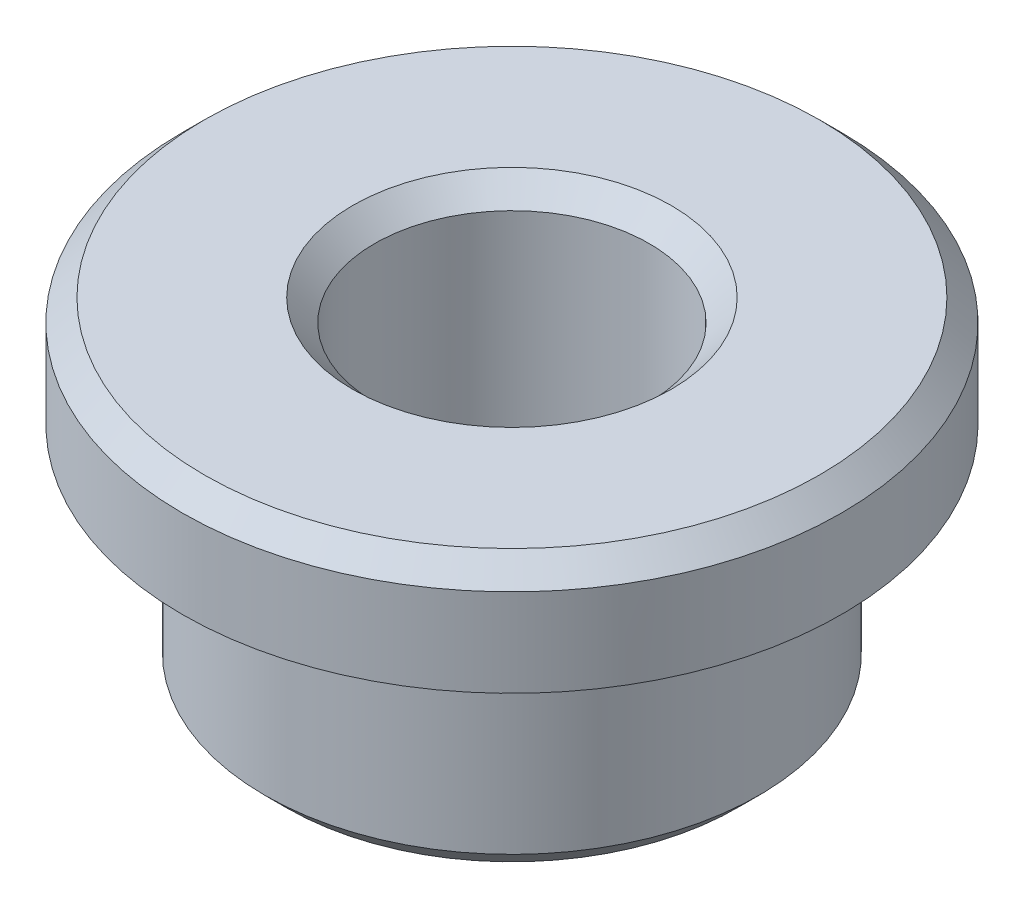
ISO-10303-21;
HEADER;
FILE_DESCRIPTION(('STEP AP214'),'2;1');
FILE_NAME('part.step','',(''),(''),'','','');
FILE_SCHEMA(('AUTOMOTIVE_DESIGN { 1 0 10303 214 1 1 1 1 }'));
ENDSEC;
DATA;
#1=APPLICATION_CONTEXT('core data for automotive mechanical design processes');
#2=APPLICATION_PROTOCOL_DEFINITION('international standard','automotive_design',2000,#1);
#3=PRODUCT_CONTEXT('',#1,'mechanical');
#4=PRODUCT('Part','Part','',(#3));
#5=PRODUCT_RELATED_PRODUCT_CATEGORY('part','',(#4));
#6=PRODUCT_DEFINITION_FORMATION('','',#4);
#7=PRODUCT_DEFINITION_CONTEXT('part definition',#1,'design');
#8=PRODUCT_DEFINITION('design','',#6,#7);
#9=PRODUCT_DEFINITION_SHAPE('','',#8);
#10=(LENGTH_UNIT() NAMED_UNIT(*) SI_UNIT(.MILLI.,.METRE.));
#11=(NAMED_UNIT(*) PLANE_ANGLE_UNIT() SI_UNIT($,.RADIAN.));
#12=(NAMED_UNIT(*) SI_UNIT($,.STERADIAN.) SOLID_ANGLE_UNIT());
#13=UNCERTAINTY_MEASURE_WITH_UNIT(LENGTH_MEASURE(1.E-05),#10,'distance_accuracy_value','');
#14=(GEOMETRIC_REPRESENTATION_CONTEXT(3) GLOBAL_UNCERTAINTY_ASSIGNED_CONTEXT((#13)) GLOBAL_UNIT_ASSIGNED_CONTEXT((#10,
#11,#12)) REPRESENTATION_CONTEXT('',''));
#15=CARTESIAN_POINT('',(0.,0.,0.));
#16=DIRECTION('',(0.,0.,1.));
#17=DIRECTION('',(1.,0.,0.));
#18=AXIS2_PLACEMENT_3D('',#15,#16,#17);
#19=CARTESIAN_POINT('',(0.,0.,-1.25));
#20=DIRECTION('',(0.,1.,0.));
#21=DIRECTION('',(0.,0.,1.));
#22=AXIS2_PLACEMENT_3D('',#19,#20,#21);
#23=PLANE('',#22);
#24=CARTESIAN_POINT('',(0.,0.,0.));
#25=DIRECTION('',(0.,1.,0.));
#26=DIRECTION('',(0.,0.,1.));
#27=AXIS2_PLACEMENT_3D('',#24,#25,#26);
#28=CIRCLE('',#27,2.05);
#29=CARTESIAN_POINT('',(0.,0.,2.05));
#30=VERTEX_POINT('',#29);
#31=EDGE_CURVE('E10',#30,#30,#28,.F.);
#32=ORIENTED_EDGE('',*,*,#31,.T.);
#33=EDGE_LOOP('',(#32));
#34=FACE_BOUND('',#33,.T.);
#35=CARTESIAN_POINT('',(0.,0.,0.));
#36=DIRECTION('',(0.,1.,0.));
#37=DIRECTION('',(0.,0.,1.));
#38=AXIS2_PLACEMENT_3D('',#35,#36,#37);
#39=CIRCLE('',#38,1.25);
#40=CARTESIAN_POINT('',(0.,0.,1.25));
#41=VERTEX_POINT('',#40);
#42=EDGE_CURVE('E65',#41,#41,#39,.T.);
#43=ORIENTED_EDGE('',*,*,#42,.T.);
#44=EDGE_LOOP('',(#43));
#45=FACE_BOUND('',#44,.T.);
#46=ADVANCED_FACE('F33',(#34,#45),#23,.F.);
#47=CARTESIAN_POINT('',(0.,6.79117403832386,0.));
#48=DIRECTION('',(0.,1.,0.));
#49=DIRECTION('',(0.,0.,1.));
#50=AXIS2_PLACEMENT_3D('',#47,#48,#49);
#51=CYLINDRICAL_SURFACE('',#50,2.25);
#52=CARTESIAN_POINT('',(0.,0.199999999999999,0.));
#53=DIRECTION('',(0.,1.,0.));
#54=DIRECTION('',(0.,0.,1.));
#55=AXIS2_PLACEMENT_3D('',#52,#53,#54);
#56=CIRCLE('',#55,2.25);
#57=CARTESIAN_POINT('',(0.,0.199999999999999,2.25));
#58=VERTEX_POINT('',#57);
#59=EDGE_CURVE('E40',#58,#58,#56,.T.);
#60=ORIENTED_EDGE('',*,*,#59,.T.);
#61=EDGE_LOOP('',(#60));
#62=FACE_BOUND('',#61,.T.);
#63=CARTESIAN_POINT('',(0.,2.,0.));
#64=DIRECTION('',(0.,1.,0.));
#65=DIRECTION('',(0.,0.,1.));
#66=AXIS2_PLACEMENT_3D('',#63,#64,#65);
#67=CIRCLE('',#66,2.25);
#68=CARTESIAN_POINT('',(0.,2.,2.25));
#69=VERTEX_POINT('',#68);
#70=EDGE_CURVE('E59',#69,#69,#67,.T.);
#71=ORIENTED_EDGE('',*,*,#70,.F.);
#72=EDGE_LOOP('',(#71));
#73=FACE_BOUND('',#72,.T.);
#74=ADVANCED_FACE('F87',(#62,#73),#51,.T.);
#75=CARTESIAN_POINT('',(0.,2.,-2.25));
#76=DIRECTION('',(0.,1.,0.));
#77=DIRECTION('',(0.,0.,1.));
#78=AXIS2_PLACEMENT_3D('',#75,#76,#77);
#79=PLANE('',#78);
#80=CARTESIAN_POINT('',(0.,2.,0.));
#81=DIRECTION('',(0.,1.,0.));
#82=DIRECTION('',(0.,0.,1.));
#83=AXIS2_PLACEMENT_3D('',#80,#81,#82);
#84=CIRCLE('',#83,3.);
#85=CARTESIAN_POINT('',(0.,2.,3.));
#86=VERTEX_POINT('',#85);
#87=EDGE_CURVE('E62',#86,#86,#84,.T.);
#88=ORIENTED_EDGE('',*,*,#87,.F.);
#89=EDGE_LOOP('',(#88));
#90=FACE_BOUND('',#89,.T.);
#91=ORIENTED_EDGE('',*,*,#70,.T.);
#92=EDGE_LOOP('',(#91));
#93=FACE_BOUND('',#92,.T.);
#94=ADVANCED_FACE('F92',(#90,#93),#79,.F.);
#95=CARTESIAN_POINT('',(0.,6.79117403832386,0.));
#96=DIRECTION('',(0.,1.,0.));
#97=DIRECTION('',(0.,0.,1.));
#98=AXIS2_PLACEMENT_3D('',#95,#96,#97);
#99=CYLINDRICAL_SURFACE('',#98,3.);
#100=CARTESIAN_POINT('',(0.,2.8,0.));
#101=DIRECTION('',(0.,-1.,0.));
#102=DIRECTION('',(0.,0.,-1.));
#103=AXIS2_PLACEMENT_3D('',#100,#101,#102);
#104=CIRCLE('',#103,3.);
#105=CARTESIAN_POINT('',(0.,2.8,-3.));
#106=VERTEX_POINT('',#105);
#107=EDGE_CURVE('E44',#106,#106,#104,.T.);
#108=ORIENTED_EDGE('',*,*,#107,.T.);
#109=EDGE_LOOP('',(#108));
#110=FACE_BOUND('',#109,.T.);
#111=ORIENTED_EDGE('',*,*,#87,.T.);
#112=EDGE_LOOP('',(#111));
#113=FACE_BOUND('',#112,.T.);
#114=ADVANCED_FACE('F83',(#110,#113),#99,.T.);
#115=CARTESIAN_POINT('',(0.,3.,-3.));
#116=DIRECTION('',(0.,-1.,0.));
#117=DIRECTION('',(0.,0.,-1.));
#118=AXIS2_PLACEMENT_3D('',#115,#116,#117);
#119=PLANE('',#118);
#120=CARTESIAN_POINT('',(0.,3.,0.));
#121=DIRECTION('',(0.,-1.,0.));
#122=DIRECTION('',(0.,0.,-1.));
#123=AXIS2_PLACEMENT_3D('',#120,#121,#122);
#124=CIRCLE('',#123,1.45);
#125=CARTESIAN_POINT('',(0.,3.,1.45));
#126=VERTEX_POINT('',#125);
#127=EDGE_CURVE('E48',#126,#126,#124,.T.);
#128=ORIENTED_EDGE('',*,*,#127,.T.);
#129=EDGE_LOOP('',(#128));
#130=FACE_BOUND('',#129,.T.);
#131=CARTESIAN_POINT('',(0.,3.,0.));
#132=DIRECTION('',(0.,-1.,0.));
#133=DIRECTION('',(0.,0.,-1.));
#134=AXIS2_PLACEMENT_3D('',#131,#132,#133);
#135=CIRCLE('',#134,2.8);
#136=CARTESIAN_POINT('',(0.,3.,-2.8));
#137=VERTEX_POINT('',#136);
#138=EDGE_CURVE('E53',#137,#137,#135,.F.);
#139=ORIENTED_EDGE('',*,*,#138,.T.);
#140=EDGE_LOOP('',(#139));
#141=FACE_BOUND('',#140,.T.);
#142=ADVANCED_FACE('F73',(#130,#141),#119,.F.);
#143=CARTESIAN_POINT('',(0.,6.79117403832386,0.));
#144=DIRECTION('',(0.,1.,0.));
#145=DIRECTION('',(0.,0.,1.));
#146=AXIS2_PLACEMENT_3D('',#143,#144,#145);
#147=CYLINDRICAL_SURFACE('',#146,1.25);
#148=CARTESIAN_POINT('',(0.,2.8,0.));
#149=DIRECTION('',(0.,-1.,0.));
#150=DIRECTION('',(0.,0.,-1.));
#151=AXIS2_PLACEMENT_3D('',#148,#149,#150);
#152=CIRCLE('',#151,1.25);
#153=CARTESIAN_POINT('',(0.,2.8,1.25));
#154=VERTEX_POINT('',#153);
#155=EDGE_CURVE('E56',#154,#154,#152,.F.);
#156=ORIENTED_EDGE('',*,*,#155,.T.);
#157=EDGE_LOOP('',(#156));
#158=FACE_BOUND('',#157,.T.);
#159=ORIENTED_EDGE('',*,*,#42,.F.);
#160=EDGE_LOOP('',(#159));
#161=FACE_BOUND('',#160,.T.);
#162=ADVANCED_FACE('F70',(#158,#161),#147,.F.);
#163=CARTESIAN_POINT('',(0.,2.8,0.));
#164=DIRECTION('',(0.,1.,0.));
#165=DIRECTION('',(0.,0.,1.));
#166=AXIS2_PLACEMENT_3D('',#163,#164,#165);
#167=CONICAL_SURFACE('',#166,1.25,0.785398163397451);
#168=CARTESIAN_POINT('',(0.,3.,1.45));
#169=CARTESIAN_POINT('',(0.,2.99791666666667,1.44791666666667));
#170=CARTESIAN_POINT('',(0.,2.99583333333333,1.44583333333333));
#171=CARTESIAN_POINT('',(0.,2.99166666666667,1.44166666666667));
#172=CARTESIAN_POINT('',(0.,2.98958333333333,1.43958333333333));
#173=CARTESIAN_POINT('',(0.,2.98541666666667,1.43541666666667));
#174=CARTESIAN_POINT('',(0.,2.98333333333333,1.43333333333333));
#175=CARTESIAN_POINT('',(0.,2.97916666666667,1.42916666666667));
#176=CARTESIAN_POINT('',(0.,2.97708333333333,1.42708333333333));
#177=CARTESIAN_POINT('',(0.,2.97291666666667,1.42291666666667));
#178=CARTESIAN_POINT('',(0.,2.97083333333333,1.42083333333333));
#179=CARTESIAN_POINT('',(0.,2.96666666666667,1.41666666666667));
#180=CARTESIAN_POINT('',(0.,2.96458333333333,1.41458333333333));
#181=CARTESIAN_POINT('',(0.,2.96041666666667,1.41041666666667));
#182=CARTESIAN_POINT('',(0.,2.95833333333333,1.40833333333333));
#183=CARTESIAN_POINT('',(0.,2.95416666666667,1.40416666666667));
#184=CARTESIAN_POINT('',(0.,2.95208333333333,1.40208333333333));
#185=CARTESIAN_POINT('',(0.,2.94791666666667,1.39791666666667));
#186=CARTESIAN_POINT('',(0.,2.94583333333333,1.39583333333333));
#187=CARTESIAN_POINT('',(0.,2.94166666666667,1.39166666666667));
#188=CARTESIAN_POINT('',(0.,2.93958333333333,1.38958333333333));
#189=CARTESIAN_POINT('',(0.,2.93541666666667,1.38541666666667));
#190=CARTESIAN_POINT('',(0.,2.93333333333333,1.38333333333333));
#191=CARTESIAN_POINT('',(0.,2.92916666666667,1.37916666666667));
#192=CARTESIAN_POINT('',(0.,2.92708333333333,1.37708333333333));
#193=CARTESIAN_POINT('',(0.,2.92291666666667,1.37291666666667));
#194=CARTESIAN_POINT('',(0.,2.92083333333333,1.37083333333333));
#195=CARTESIAN_POINT('',(0.,2.91666666666667,1.36666666666667));
#196=CARTESIAN_POINT('',(0.,2.91458333333333,1.36458333333333));
#197=CARTESIAN_POINT('',(0.,2.91041666666667,1.36041666666667));
#198=CARTESIAN_POINT('',(0.,2.90833333333333,1.35833333333333));
#199=CARTESIAN_POINT('',(0.,2.90416666666667,1.35416666666667));
#200=CARTESIAN_POINT('',(0.,2.90208333333333,1.35208333333333));
#201=CARTESIAN_POINT('',(0.,2.89791666666667,1.34791666666667));
#202=CARTESIAN_POINT('',(0.,2.89583333333333,1.34583333333333));
#203=CARTESIAN_POINT('',(0.,2.89166666666667,1.34166666666667));
#204=CARTESIAN_POINT('',(0.,2.88958333333333,1.33958333333333));
#205=CARTESIAN_POINT('',(0.,2.88541666666667,1.33541666666667));
#206=CARTESIAN_POINT('',(0.,2.88333333333333,1.33333333333333));
#207=CARTESIAN_POINT('',(0.,2.87916666666667,1.32916666666667));
#208=CARTESIAN_POINT('',(0.,2.87708333333333,1.32708333333333));
#209=CARTESIAN_POINT('',(0.,2.87291666666667,1.32291666666667));
#210=CARTESIAN_POINT('',(0.,2.87083333333333,1.32083333333333));
#211=CARTESIAN_POINT('',(0.,2.86666666666667,1.31666666666667));
#212=CARTESIAN_POINT('',(0.,2.86458333333333,1.31458333333333));
#213=CARTESIAN_POINT('',(0.,2.86041666666667,1.31041666666667));
#214=CARTESIAN_POINT('',(0.,2.85833333333333,1.30833333333333));
#215=CARTESIAN_POINT('',(0.,2.85416666666667,1.30416666666667));
#216=CARTESIAN_POINT('',(0.,2.85208333333333,1.30208333333333));
#217=CARTESIAN_POINT('',(0.,2.84791666666667,1.29791666666667));
#218=CARTESIAN_POINT('',(0.,2.84583333333333,1.29583333333333));
#219=CARTESIAN_POINT('',(0.,2.84166666666667,1.29166666666667));
#220=CARTESIAN_POINT('',(0.,2.83958333333333,1.28958333333333));
#221=CARTESIAN_POINT('',(0.,2.83541666666667,1.28541666666667));
#222=CARTESIAN_POINT('',(0.,2.83333333333333,1.28333333333333));
#223=CARTESIAN_POINT('',(0.,2.82916666666667,1.27916666666667));
#224=CARTESIAN_POINT('',(0.,2.82708333333333,1.27708333333333));
#225=CARTESIAN_POINT('',(0.,2.82291666666667,1.27291666666667));
#226=CARTESIAN_POINT('',(0.,2.82083333333333,1.27083333333333));
#227=CARTESIAN_POINT('',(0.,2.81666666666667,1.26666666666667));
#228=CARTESIAN_POINT('',(0.,2.81458333333333,1.26458333333333));
#229=CARTESIAN_POINT('',(0.,2.81041666666667,1.26041666666667));
#230=CARTESIAN_POINT('',(0.,2.80833333333333,1.25833333333333));
#231=CARTESIAN_POINT('',(0.,2.80416666666667,1.25416666666667));
#232=CARTESIAN_POINT('',(0.,2.80208333333333,1.25208333333333));
#233=CARTESIAN_POINT('',(0.,2.8,1.25));
#234=B_SPLINE_CURVE_WITH_KNOTS('',3,(#168,#169,#170,#171,#172,#173,#174,#175,#176,#177,#178,
#179,#180,#181,#182,#183,#184,#185,#186,#187,#188,#189,#190,#191,#192,#193,#194,#195,#196,#197,
#198,#199,#200,#201,#202,#203,#204,#205,#206,#207,#208,#209,#210,#211,#212,#213,#214,#215,#216,
#217,#218,#219,#220,#221,#222,#223,#224,#225,#226,#227,#228,#229,#230,#231,#232,#233),
.UNSPECIFIED.,.F.,.F.,(4,2,2,2,2,2,2,2,2,2,2,2,2,2,2,2,2,2,2,2,2,2,2,2,2,2,2,2,2,2,2,2,4),(0.,
0.00883883476483164,0.0176776695296636,0.0265165042944954,0.0353553390593273,0.044194173824159,
0.0530330085889909,0.0618718433538227,0.0707106781186546,0.0795495128834863,0.0883883476483182,
0.0972271824131498,0.106066017177982,0.114904851942814,0.123743686707646,0.132582521472477,
0.141421356237309,0.150260191002141,0.159099025766973,0.167937860531805,0.176776695296636,
0.185615530061468,0.1944543648263,0.203293199591132,0.212132034355964,0.220970869120796,
0.229809703885627,0.238648538650459,0.247487373415291,0.256326208180123,0.265165042944955,
0.274003877709787,0.282842712474619),.UNSPECIFIED.);
#235=EDGE_CURVE('BSEAM72',#126,#154,#234,.T.);
#236=ORIENTED_EDGE('',*,*,#127,.F.);
#237=ORIENTED_EDGE('',*,*,#155,.F.);
#238=ORIENTED_EDGE('',*,*,#235,.T.);
#239=ORIENTED_EDGE('',*,*,#235,.F.);
#240=EDGE_LOOP('',(#236,#238,#237,#239));
#241=FACE_BOUND('',#240,.T.);
#242=ADVANCED_FACE('F72',(#241),#167,.F.);
#243=CARTESIAN_POINT('',(0.,3.,0.));
#244=DIRECTION('',(0.,-1.,0.));
#245=DIRECTION('',(0.,0.,-1.));
#246=AXIS2_PLACEMENT_3D('',#243,#244,#245);
#247=CONICAL_SURFACE('',#246,2.8,0.785398163397444);
#248=ORIENTED_EDGE('',*,*,#107,.F.);
#249=EDGE_LOOP('',(#248));
#250=FACE_BOUND('',#249,.T.);
#251=ORIENTED_EDGE('',*,*,#138,.F.);
#252=EDGE_LOOP('',(#251));
#253=FACE_BOUND('',#252,.T.);
#254=ADVANCED_FACE('F80',(#250,#253),#247,.T.);
#255=CARTESIAN_POINT('',(0.,0.199999999999999,0.));
#256=DIRECTION('',(0.,1.,0.));
#257=DIRECTION('',(0.,0.,1.));
#258=AXIS2_PLACEMENT_3D('',#255,#256,#257);
#259=CONICAL_SURFACE('',#258,2.25,0.785398163397452);
#260=ORIENTED_EDGE('',*,*,#31,.F.);
#261=EDGE_LOOP('',(#260));
#262=FACE_BOUND('',#261,.T.);
#263=ORIENTED_EDGE('',*,*,#59,.F.);
#264=EDGE_LOOP('',(#263));
#265=FACE_BOUND('',#264,.T.);
#266=ADVANCED_FACE('F35',(#262,#265),#259,.T.);
#267=CLOSED_SHELL('',(#46,#74,#94,#114,#142,#162,#242,#254,#266));
#268=MANIFOLD_SOLID_BREP('B2',#267);
#269=ADVANCED_BREP_SHAPE_REPRESENTATION('',(#18,#268),#14);
#270=SHAPE_DEFINITION_REPRESENTATION(#9,#269);
ENDSEC;
END-ISO-10303-21;
